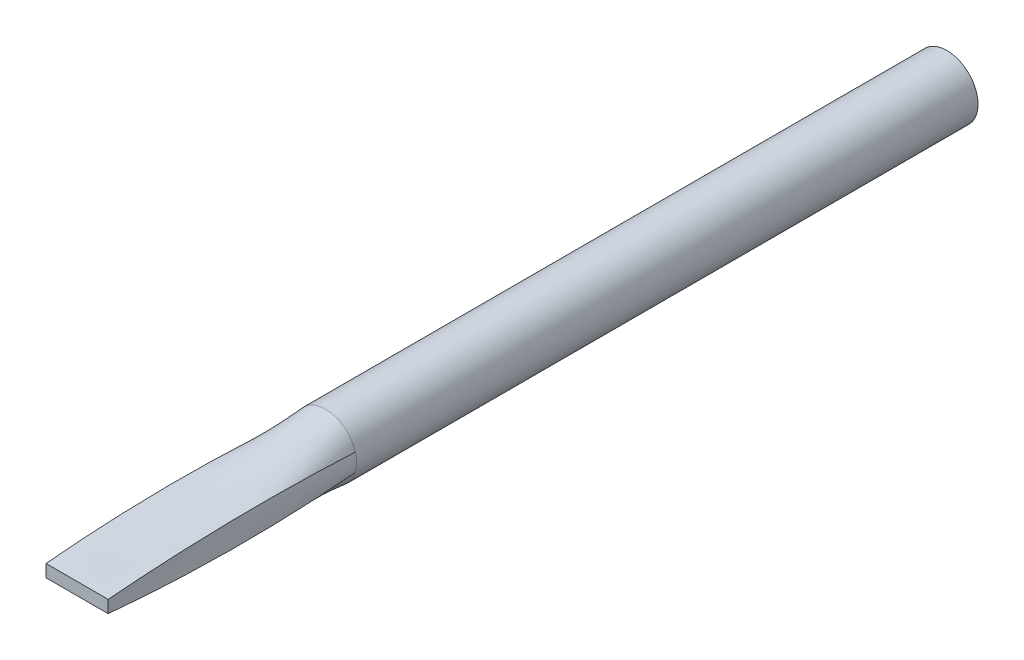
ISO-10303-21;
HEADER;
FILE_DESCRIPTION(('STEP AP214'),'2;1');
FILE_NAME('part.step','',(''),(''),'','','');
FILE_SCHEMA(('AUTOMOTIVE_DESIGN { 1 0 10303 214 1 1 1 1 }'));
ENDSEC;
DATA;
#1=APPLICATION_CONTEXT('core data for automotive mechanical design processes');
#2=APPLICATION_PROTOCOL_DEFINITION('international standard','automotive_design',2000,#1);
#3=PRODUCT_CONTEXT('',#1,'mechanical');
#4=PRODUCT('Part','Part','',(#3));
#5=PRODUCT_RELATED_PRODUCT_CATEGORY('part','',(#4));
#6=PRODUCT_DEFINITION_FORMATION('','',#4);
#7=PRODUCT_DEFINITION_CONTEXT('part definition',#1,'design');
#8=PRODUCT_DEFINITION('design','',#6,#7);
#9=PRODUCT_DEFINITION_SHAPE('','',#8);
#10=(LENGTH_UNIT() NAMED_UNIT(*) SI_UNIT(.MILLI.,.METRE.));
#11=(NAMED_UNIT(*) PLANE_ANGLE_UNIT() SI_UNIT($,.RADIAN.));
#12=(NAMED_UNIT(*) SI_UNIT($,.STERADIAN.) SOLID_ANGLE_UNIT());
#13=UNCERTAINTY_MEASURE_WITH_UNIT(LENGTH_MEASURE(1.E-05),#10,'distance_accuracy_value','');
#14=(GEOMETRIC_REPRESENTATION_CONTEXT(3) GLOBAL_UNCERTAINTY_ASSIGNED_CONTEXT((#13)) GLOBAL_UNIT_ASSIGNED_CONTEXT((#10,
#11,#12)) REPRESENTATION_CONTEXT('',''));
#15=CARTESIAN_POINT('',(0.,0.,0.));
#16=DIRECTION('',(0.,0.,1.));
#17=DIRECTION('',(1.,0.,0.));
#18=AXIS2_PLACEMENT_3D('',#15,#16,#17);
#19=CARTESIAN_POINT('',(0.,0.,127.));
#20=DIRECTION('',(0.,0.,-1.));
#21=DIRECTION('',(-1.,0.,0.));
#22=AXIS2_PLACEMENT_3D('',#19,#20,#21);
#23=CYLINDRICAL_SURFACE('',#22,6.35);
#24=CARTESIAN_POINT('',(6.08675008896476,1.80941243349533,127.));
#25=CARTESIAN_POINT('',(5.88662893530732,2.4826074592834,127.));
#26=CARTESIAN_POINT('',(5.27712066277255,3.7224132887284,127.));
#27=CARTESIAN_POINT('',(4.0952221483163,4.93319956506952,127.));
#28=CARTESIAN_POINT('',(2.9614420521793,5.64580659727017,127.));
#29=CARTESIAN_POINT('',(1.72926984224055,6.17710534020826,127.));
#30=CARTESIAN_POINT('',(-0.000199118194714638,6.46583814686533,127.));
#31=CARTESIAN_POINT('',(-1.7288815989428,6.17717120786637,127.));
#32=CARTESIAN_POINT('',(-2.9615046096893,5.64580968166895,127.));
#33=CARTESIAN_POINT('',(-4.09507070022622,4.93328659384653,127.));
#34=CARTESIAN_POINT('',(-5.27721129069912,3.72236060594632,127.));
#35=CARTESIAN_POINT('',(-5.88662893530732,2.4826074592834,127.));
#36=CARTESIAN_POINT('',(-6.08675008896476,1.80941243349533,127.));
#37=B_SPLINE_CURVE_WITH_KNOTS('',3,(#24,#25,#26,#27,#28,#29,#30,#31,#32,#33,#34,#35,#36),
.UNSPECIFIED.,.F.,.F.,(4,1,1,1,1,1,1,1,1,1,4),(0.,0.125,0.25,0.3125,0.375,0.5,0.625,0.6875,0.75,
0.875,1.),.UNSPECIFIED.);
#38=CARTESIAN_POINT('',(6.08678603843591,1.8094231221408,127.));
#39=VERTEX_POINT('',#38);
#40=CARTESIAN_POINT('',(-6.08678456255015,1.80942267357701,127.));
#41=VERTEX_POINT('',#40);
#42=EDGE_CURVE('E12',#39,#41,#37,.T.);
#43=ORIENTED_EDGE('',*,*,#42,.F.);
#44=CARTESIAN_POINT('',(0.,0.,127.));
#45=DIRECTION('',(0.,0.,-1.));
#46=DIRECTION('',(1.,0.,0.));
#47=AXIS2_PLACEMENT_3D('',#44,#45,#46);
#48=CIRCLE('',#47,6.35);
#49=CARTESIAN_POINT('',(6.08678456254978,-1.8094226735769,127.));
#50=VERTEX_POINT('',#49);
#51=EDGE_CURVE('E131',#50,#39,#48,.F.);
#52=ORIENTED_EDGE('',*,*,#51,.F.);
#53=CARTESIAN_POINT('',(0.,0.,127.));
#54=DIRECTION('',(0.,0.,1.));
#55=DIRECTION('',(1.,0.,0.));
#56=AXIS2_PLACEMENT_3D('',#53,#54,#55);
#57=CIRCLE('',#56,6.35);
#58=CARTESIAN_POINT('',(-6.08678603843585,-1.80942312214078,127.));
#59=VERTEX_POINT('',#58);
#60=EDGE_CURVE('E117',#59,#50,#57,.T.);
#61=ORIENTED_EDGE('',*,*,#60,.F.);
#62=CARTESIAN_POINT('',(0.,0.,127.));
#63=DIRECTION('',(0.,0.,1.));
#64=DIRECTION('',(1.,0.,0.));
#65=AXIS2_PLACEMENT_3D('',#62,#63,#64);
#66=CIRCLE('',#65,6.35);
#67=EDGE_CURVE('E136',#41,#59,#66,.T.);
#68=ORIENTED_EDGE('',*,*,#67,.F.);
#69=EDGE_LOOP('',(#43,#52,#61,#68));
#70=FACE_BOUND('',#69,.T.);
#71=CARTESIAN_POINT('',(0.,0.,0.));
#72=DIRECTION('',(0.,0.,1.));
#73=DIRECTION('',(1.,0.,0.));
#74=AXIS2_PLACEMENT_3D('',#71,#72,#73);
#75=CIRCLE('',#74,6.35);
#76=CARTESIAN_POINT('',(6.35,0.,0.));
#77=VERTEX_POINT('',#76);
#78=EDGE_CURVE('E124',#77,#77,#75,.T.);
#79=ORIENTED_EDGE('',*,*,#78,.T.);
#80=EDGE_LOOP('',(#79));
#81=FACE_BOUND('',#80,.T.);
#82=ADVANCED_FACE('F113',(#70,#81),#23,.T.);
#83=CARTESIAN_POINT('',(0.,0.,0.));
#84=DIRECTION('',(0.,0.,1.));
#85=DIRECTION('',(1.,0.,0.));
#86=AXIS2_PLACEMENT_3D('',#83,#84,#85);
#87=PLANE('',#86);
#88=ORIENTED_EDGE('',*,*,#78,.F.);
#89=EDGE_LOOP('',(#88));
#90=FACE_BOUND('',#89,.T.);
#91=ADVANCED_FACE('F355',(#90),#87,.F.);
#92=CARTESIAN_POINT('',(0.,0.,177.8));
#93=DIRECTION('',(0.,0.,1.));
#94=DIRECTION('',(1.,0.,0.));
#95=AXIS2_PLACEMENT_3D('',#92,#93,#94);
#96=PLANE('',#95);
#97=DIRECTION('',(0.,1.,0.));
#98=VECTOR('',#97,1.);
#99=CARTESIAN_POINT('',(6.35,1.27,177.8));
#100=LINE('',#99,#98);
#101=CARTESIAN_POINT('',(6.35,-1.27,177.8));
#102=VERTEX_POINT('',#101);
#103=CARTESIAN_POINT('',(6.35,1.27,177.8));
#104=VERTEX_POINT('',#103);
#105=EDGE_CURVE('E183',#102,#104,#100,.T.);
#106=ORIENTED_EDGE('',*,*,#105,.T.);
#107=DIRECTION('',(-1.,0.,0.));
#108=VECTOR('',#107,1.);
#109=CARTESIAN_POINT('',(-6.35,1.27,177.8));
#110=LINE('',#109,#108);
#111=CARTESIAN_POINT('',(-6.35,1.27,177.8));
#112=VERTEX_POINT('',#111);
#113=EDGE_CURVE('E163',#104,#112,#110,.T.);
#114=ORIENTED_EDGE('',*,*,#113,.T.);
#115=DIRECTION('',(0.,-1.,0.));
#116=VECTOR('',#115,1.);
#117=CARTESIAN_POINT('',(-6.35,1.27,177.8));
#118=LINE('',#117,#116);
#119=CARTESIAN_POINT('',(-6.35,-1.27,177.8));
#120=VERTEX_POINT('',#119);
#121=EDGE_CURVE('E154',#112,#120,#118,.T.);
#122=ORIENTED_EDGE('',*,*,#121,.T.);
#123=DIRECTION('',(1.,0.,0.));
#124=VECTOR('',#123,1.);
#125=CARTESIAN_POINT('',(-6.35,-1.27,177.8));
#126=LINE('',#125,#124);
#127=EDGE_CURVE('E159',#120,#102,#126,.T.);
#128=ORIENTED_EDGE('',*,*,#127,.T.);
#129=EDGE_LOOP('',(#106,#114,#122,#128));
#130=FACE_BOUND('',#129,.T.);
#131=ADVANCED_FACE('F158',(#130),#96,.T.);
#132=CARTESIAN_POINT('',(6.08675008896476,1.80941243349533,127.));
#133=CARTESIAN_POINT('',(6.21839221099425,2.38633770835992,135.469979331806));
#134=CARTESIAN_POINT('',(6.39367456706093,2.87384285204551,152.361306329476));
#135=CARTESIAN_POINT('',(6.39389215168441,2.02672941936304,169.336645998472));
#136=CARTESIAN_POINT('',(6.35,1.27,177.8));
#137=CARTESIAN_POINT('',(5.88662893530732,2.4826074592834,127.));
#138=CARTESIAN_POINT('',(5.88382088402349,2.73817024314201,135.470398235068));
#139=CARTESIAN_POINT('',(5.7898783330942,2.75199844276133,152.360887425299));
#140=CARTESIAN_POINT('',(5.8198892283466,1.91954425402526,169.337064901735));
#141=CARTESIAN_POINT('',(5.82083333333333,1.27,177.8));
#142=CARTESIAN_POINT('',(5.27712066277255,3.7224132887284,127.));
#143=CARTESIAN_POINT('',(5.00541226486208,3.33525109057502,135.471236041592));
#144=CARTESIAN_POINT('',(4.68670045297844,2.56149050150381,152.360049616946));
#145=CARTESIAN_POINT('',(4.67188338167096,1.70517392334972,169.337902708259));
#146=CARTESIAN_POINT('',(4.7625,1.27,177.8));
#147=CARTESIAN_POINT('',(4.0952221483163,4.93319956506952,127.));
#148=CARTESIAN_POINT('',(3.76935955722444,3.95008554288471,135.452465824941));
#149=CARTESIAN_POINT('',(3.32940195376154,2.35383380275496,152.37881987457));
#150=CARTESIAN_POINT('',(3.33108512887952,1.50734995036563,169.319132491608));
#151=CARTESIAN_POINT('',(3.43958333333333,1.27,177.8));
#152=CARTESIAN_POINT('',(2.9614420521793,5.64580659727017,127.));
#153=CARTESIAN_POINT('',(2.67133453203728,4.30670201401367,135.439690378247));
#154=CARTESIAN_POINT('',(2.2848579299932,2.2348912499158,152.391595349152));
#155=CARTESIAN_POINT('',(2.28475691189425,1.38960919923241,169.306357044913));
#156=CARTESIAN_POINT('',(2.38125,1.27,177.8));
#157=CARTESIAN_POINT('',(1.72926984224055,6.17710534020826,127.));
#158=CARTESIAN_POINT('',(1.52659802327358,4.5739484135369,135.428697008474));
#159=CARTESIAN_POINT('',(1.25502966256591,2.14520372563824,152.402588742921));
#160=CARTESIAN_POINT('',(1.25557530338823,1.30247790214429,169.295363675141));
#161=CARTESIAN_POINT('',(1.32291666666667,1.27,177.8));
#162=CARTESIAN_POINT('',(-0.000199118194714638,6.46583814686533,127.));
#163=CARTESIAN_POINT('',(-9.97323945062288E-05,4.71908730216013,135.422108275891));
#164=CARTESIAN_POINT('',(3.32115469491224E-05,2.09645418026079,152.409177489886));
#165=CARTESIAN_POINT('',(3.30320443327299E-05,1.25523984853949,169.288774942557));
#166=CARTESIAN_POINT('',(0.,1.27,177.8));
#167=CARTESIAN_POINT('',(-1.7288815989428,6.17717120786637,127.));
#168=CARTESIAN_POINT('',(-1.52640355430358,4.5739814854675,135.428696499264));
#169=CARTESIAN_POINT('',(-1.25509441831998,2.14519267065703,152.402589252132));
#170=CARTESIAN_POINT('',(-1.25563972021048,1.3024670319416,169.295363165931));
#171=CARTESIAN_POINT('',(-1.32291666666667,1.27,177.8));
#172=CARTESIAN_POINT('',(-2.9615046096893,5.64580968166895,127.));
#173=CARTESIAN_POINT('',(-2.67136599593577,4.30670349941177,135.439690133395));
#174=CARTESIAN_POINT('',(-2.28484740968318,2.23489076741558,152.391595594004));
#175=CARTESIAN_POINT('',(-2.2847465759076,1.38960868301486,169.306356800062));
#176=CARTESIAN_POINT('',(-2.38125,1.27,177.8));
#177=CARTESIAN_POINT('',(-4.09507070022622,4.93328659384653,127.));
#178=CARTESIAN_POINT('',(-3.76928301461781,3.95012959195073,135.452464982665));
#179=CARTESIAN_POINT('',(-3.32942765154064,2.35381897294306,152.378820716848));
#180=CARTESIAN_POINT('',(-3.33111006401009,1.50733568270706,169.319131649332));
#181=CARTESIAN_POINT('',(-3.43958333333333,1.27,177.8));
#182=CARTESIAN_POINT('',(-5.27721129069912,3.72236060594632,127.));
#183=CARTESIAN_POINT('',(-5.00546379892161,3.33522111241195,135.471236353842));
#184=CARTESIAN_POINT('',(-4.68668126397854,2.5615016772554,152.360049304696));
#185=CARTESIAN_POINT('',(-4.67187036041093,1.70518147164968,169.337903020509));
#186=CARTESIAN_POINT('',(-4.7625,1.27,177.8));
#187=CARTESIAN_POINT('',(-5.88662893530732,2.4826074592834,127.));
#188=CARTESIAN_POINT('',(-5.88380785273448,2.73817781134834,135.470398339151));
#189=CARTESIAN_POINT('',(-5.7898870098882,2.75199340587517,152.360887321216));
#190=CARTESIAN_POINT('',(-5.81988488792659,1.91954677012525,169.337065005818));
#191=CARTESIAN_POINT('',(-5.82083333333333,1.27,177.8));
#192=CARTESIAN_POINT('',(-6.08675008896476,1.80941243349533,127.));
#193=CARTESIAN_POINT('',(-6.21839221099425,2.38633770835992,135.469979331806));
#194=CARTESIAN_POINT('',(-6.39367456706094,2.87384285204551,152.361306329476));
#195=CARTESIAN_POINT('',(-6.39389215168441,2.02672941936304,169.336645998472));
#196=CARTESIAN_POINT('',(-6.35,1.27,177.8));
#197=B_SPLINE_SURFACE_WITH_KNOTS('',3,3,((#132,#133,#134,#135,#136),(#137,#138,#139,#140,#141),
(#142,#143,#144,#145,#146),(#147,#148,#149,#150,#151),(#152,#153,#154,#155,#156),(#157,#158,
#159,#160,#161),(#162,#163,#164,#165,#166),(#167,#168,#169,#170,#171),(#172,#173,#174,#175,
#176),(#177,#178,#179,#180,#181),(#182,#183,#184,#185,#186),(#187,#188,#189,#190,#191),(#192,
#193,#194,#195,#196)),.UNSPECIFIED.,.F.,.F.,.F.,(4,1,1,1,1,1,1,1,1,1,4),(4,1,4),(0.,0.125,0.25,
0.3125,0.375,0.5,0.625,0.6875,0.75,0.875,1.),(0.,0.500522356686095,1.),.UNSPECIFIED.);
#198=CARTESIAN_POINT('',(-6.08675008896476,1.80941243349533,127.));
#199=CARTESIAN_POINT('',(-6.21839221099425,2.38633770835992,135.469979331806));
#200=CARTESIAN_POINT('',(-6.39367456706094,2.87384285204551,152.361306329476));
#201=CARTESIAN_POINT('',(-6.39389215168441,2.02672941936304,169.336645998472));
#202=CARTESIAN_POINT('',(-6.35,1.27,177.8));
#203=B_SPLINE_CURVE_WITH_KNOTS('',3,(#198,#199,#200,#201,#202),.UNSPECIFIED.,.F.,.F.,(4,1,4),
(0.,0.500522356686095,1.),.UNSPECIFIED.);
#204=EDGE_CURVE('E189',#41,#112,#203,.T.);
#205=CARTESIAN_POINT('',(6.08675008896476,1.80941243349533,127.));
#206=CARTESIAN_POINT('',(6.21839221099425,2.38633770835992,135.469979331806));
#207=CARTESIAN_POINT('',(6.39367456706093,2.87384285204551,152.361306329476));
#208=CARTESIAN_POINT('',(6.39389215168441,2.02672941936304,169.336645998472));
#209=CARTESIAN_POINT('',(6.35,1.27,177.8));
#210=B_SPLINE_CURVE_WITH_KNOTS('',3,(#205,#206,#207,#208,#209),.UNSPECIFIED.,.F.,.F.,(4,1,4),
(0.,0.500522356686095,1.),.UNSPECIFIED.);
#211=EDGE_CURVE('E194',#104,#39,#210,.F.);
#212=ORIENTED_EDGE('',*,*,#42,.T.);
#213=ORIENTED_EDGE('',*,*,#204,.T.);
#214=ORIENTED_EDGE('',*,*,#113,.F.);
#215=ORIENTED_EDGE('',*,*,#211,.T.);
#216=EDGE_LOOP('',(#212,#213,#214,#215));
#217=FACE_BOUND('',#216,.T.);
#218=ADVANCED_FACE('F226',(#217),#197,.T.);
#219=CARTESIAN_POINT('',(-6.08675008896476,1.80941243349533,127.));
#220=CARTESIAN_POINT('',(-6.21839221099425,2.38633770835992,135.469979331806));
#221=CARTESIAN_POINT('',(-6.39367456706094,2.87384285204551,152.361306329476));
#222=CARTESIAN_POINT('',(-6.39389215168441,2.02672941936304,169.336645998472));
#223=CARTESIAN_POINT('',(-6.35,1.27,177.8));
#224=CARTESIAN_POINT('',(-6.43773733835281,0.628713311564739,127.));
#225=CARTESIAN_POINT('',(-6.56937946038231,0.821021736519602,135.469979331806));
#226=CARTESIAN_POINT('',(-6.21854724076298,0.945186392012529,152.361306329476));
#227=CARTESIAN_POINT('',(-6.39389215168441,0.675576473121011,169.336645998472));
#228=CARTESIAN_POINT('',(-6.35,0.423333333333333,177.8));
#229=CARTESIAN_POINT('',(-6.43773733835281,-0.628713311564736,127.));
#230=CARTESIAN_POINT('',(-6.56937946038231,-0.821021736519603,135.469979331806));
#231=CARTESIAN_POINT('',(-6.21854724076298,-0.945186392012532,152.361306329476));
#232=CARTESIAN_POINT('',(-6.39389215168441,-0.675576473121014,169.336645998472));
#233=CARTESIAN_POINT('',(-6.35,-0.423333333333333,177.8));
#234=CARTESIAN_POINT('',(-6.08675008896476,-1.80941243349533,127.));
#235=CARTESIAN_POINT('',(-6.21839221099425,-2.38633770835992,135.469979331806));
#236=CARTESIAN_POINT('',(-6.39367456706093,-2.87384285204551,152.361306329476));
#237=CARTESIAN_POINT('',(-6.39389215168441,-2.02672941936304,169.336645998472));
#238=CARTESIAN_POINT('',(-6.35,-1.27,177.8));
#239=B_SPLINE_SURFACE_WITH_KNOTS('',3,3,((#219,#220,#221,#222,#223),(#224,#225,#226,#227,#228),
(#229,#230,#231,#232,#233),(#234,#235,#236,#237,#238)),.UNSPECIFIED.,.F.,.F.,.F.,(4,4),(4,1,4),
(0.,1.),(0.,0.500522356686095,1.),.UNSPECIFIED.);
#240=CARTESIAN_POINT('',(-6.08675008896476,-1.80941243349533,127.));
#241=CARTESIAN_POINT('',(-6.21839221099425,-2.38633770835992,135.469979331806));
#242=CARTESIAN_POINT('',(-6.39367456706093,-2.87384285204551,152.361306329476));
#243=CARTESIAN_POINT('',(-6.39389215168441,-2.02672941936304,169.336645998472));
#244=CARTESIAN_POINT('',(-6.35,-1.27,177.8));
#245=B_SPLINE_CURVE_WITH_KNOTS('',3,(#240,#241,#242,#243,#244),.UNSPECIFIED.,.F.,.F.,(4,1,4),
(0.,0.500522356686095,1.),.UNSPECIFIED.);
#246=EDGE_CURVE('E179',#59,#120,#245,.T.);
#247=ORIENTED_EDGE('',*,*,#67,.T.);
#248=ORIENTED_EDGE('',*,*,#246,.T.);
#249=ORIENTED_EDGE('',*,*,#121,.F.);
#250=ORIENTED_EDGE('',*,*,#204,.F.);
#251=EDGE_LOOP('',(#247,#248,#249,#250));
#252=FACE_BOUND('',#251,.T.);
#253=ADVANCED_FACE('F187',(#252),#239,.T.);
#254=CARTESIAN_POINT('',(6.08675008896476,-1.80941243349533,127.));
#255=CARTESIAN_POINT('',(6.21839221099425,-2.38633770835992,135.469979331806));
#256=CARTESIAN_POINT('',(6.39367456706094,-2.87384285204551,152.361306329476));
#257=CARTESIAN_POINT('',(6.39389215168441,-2.02672941936304,169.336645998472));
#258=CARTESIAN_POINT('',(6.35,-1.27,177.8));
#259=CARTESIAN_POINT('',(6.43773733835281,-0.628713311564739,127.));
#260=CARTESIAN_POINT('',(6.56937946038231,-0.821021736519604,135.469979331806));
#261=CARTESIAN_POINT('',(6.21854724076298,-0.945186392012532,152.361306329476));
#262=CARTESIAN_POINT('',(6.39389215168441,-0.675576473121013,169.336645998472));
#263=CARTESIAN_POINT('',(6.35,-0.423333333333333,177.8));
#264=CARTESIAN_POINT('',(6.43773733835281,0.628713311564736,127.));
#265=CARTESIAN_POINT('',(6.56937946038231,0.821021736519601,135.469979331806));
#266=CARTESIAN_POINT('',(6.21854724076298,0.945186392012529,152.361306329476));
#267=CARTESIAN_POINT('',(6.39389215168441,0.675576473121012,169.336645998472));
#268=CARTESIAN_POINT('',(6.35,0.423333333333333,177.8));
#269=CARTESIAN_POINT('',(6.08675008896476,1.80941243349533,127.));
#270=CARTESIAN_POINT('',(6.21839221099425,2.38633770835992,135.469979331806));
#271=CARTESIAN_POINT('',(6.39367456706093,2.87384285204551,152.361306329476));
#272=CARTESIAN_POINT('',(6.39389215168441,2.02672941936304,169.336645998472));
#273=CARTESIAN_POINT('',(6.35,1.27,177.8));
#274=B_SPLINE_SURFACE_WITH_KNOTS('',3,3,((#254,#255,#256,#257,#258),(#259,#260,#261,#262,#263),
(#264,#265,#266,#267,#268),(#269,#270,#271,#272,#273)),.UNSPECIFIED.,.F.,.F.,.F.,(4,4),(4,1,4),
(0.,1.),(0.,0.500522356686095,1.),.UNSPECIFIED.);
#275=CARTESIAN_POINT('',(6.08675008896476,-1.80941243349533,127.));
#276=CARTESIAN_POINT('',(6.21839221099425,-2.38633770835992,135.469979331806));
#277=CARTESIAN_POINT('',(6.39367456706093,-2.87384285204551,152.361306329476));
#278=CARTESIAN_POINT('',(6.39389215168441,-2.02672941936304,169.336645998472));
#279=CARTESIAN_POINT('',(6.35,-1.27,177.8));
#280=B_SPLINE_CURVE_WITH_KNOTS('',3,(#275,#276,#277,#278,#279),.UNSPECIFIED.,.F.,.F.,(4,1,4),
(0.,0.500522356686095,1.),.UNSPECIFIED.);
#281=EDGE_CURVE('E181',#50,#102,#280,.T.);
#282=ORIENTED_EDGE('',*,*,#51,.T.);
#283=ORIENTED_EDGE('',*,*,#211,.F.);
#284=ORIENTED_EDGE('',*,*,#105,.F.);
#285=ORIENTED_EDGE('',*,*,#281,.F.);
#286=EDGE_LOOP('',(#282,#283,#284,#285));
#287=FACE_BOUND('',#286,.T.);
#288=ADVANCED_FACE('F308',(#287),#274,.T.);
#289=CARTESIAN_POINT('',(-6.08675008896476,-1.80941243349533,127.));
#290=CARTESIAN_POINT('',(-6.21839221099425,-2.38633770835992,135.469979331806));
#291=CARTESIAN_POINT('',(-6.39367456706093,-2.87384285204551,152.361306329476));
#292=CARTESIAN_POINT('',(-6.39389215168441,-2.02672941936304,169.336645998472));
#293=CARTESIAN_POINT('',(-6.35,-1.27,177.8));
#294=CARTESIAN_POINT('',(-5.88662893530732,-2.4826074592834,127.));
#295=CARTESIAN_POINT('',(-5.88382088402349,-2.73817024314201,135.470398235068));
#296=CARTESIAN_POINT('',(-5.78987833309421,-2.75199844276133,152.360887425299));
#297=CARTESIAN_POINT('',(-5.8198892283466,-1.91954425402527,169.337064901735));
#298=CARTESIAN_POINT('',(-5.82083333333333,-1.27,177.8));
#299=CARTESIAN_POINT('',(-5.27712066277255,-3.72241328872839,127.));
#300=CARTESIAN_POINT('',(-5.00541226486208,-3.33525109057502,135.471236041592));
#301=CARTESIAN_POINT('',(-4.68670045297844,-2.56149050150381,152.360049616946));
#302=CARTESIAN_POINT('',(-4.67188338167096,-1.70517392334973,169.337902708259));
#303=CARTESIAN_POINT('',(-4.7625,-1.27,177.8));
#304=CARTESIAN_POINT('',(-4.09522214831631,-4.93319956506953,127.));
#305=CARTESIAN_POINT('',(-3.76935955722444,-3.95008554288472,135.452465824942));
#306=CARTESIAN_POINT('',(-3.32940195376154,-2.35383380275497,152.37881987457));
#307=CARTESIAN_POINT('',(-3.33108512887952,-1.50734995036563,169.319132491608));
#308=CARTESIAN_POINT('',(-3.43958333333333,-1.27,177.8));
#309=CARTESIAN_POINT('',(-2.9614420521793,-5.64580659727016,127.));
#310=CARTESIAN_POINT('',(-2.67133453203728,-4.30670201401367,135.439690378247));
#311=CARTESIAN_POINT('',(-2.2848579299932,-2.2348912499158,152.391595349152));
#312=CARTESIAN_POINT('',(-2.28475691189425,-1.38960919923242,169.306357044913));
#313=CARTESIAN_POINT('',(-2.38125,-1.27,177.8));
#314=CARTESIAN_POINT('',(-1.72926984224055,-6.17710534020827,127.));
#315=CARTESIAN_POINT('',(-1.52659802327358,-4.5739484135369,135.428697008474));
#316=CARTESIAN_POINT('',(-1.25502966256591,-2.14520372563825,152.402588742921));
#317=CARTESIAN_POINT('',(-1.25557530338823,-1.30247790214429,169.295363675141));
#318=CARTESIAN_POINT('',(-1.32291666666667,-1.27,177.8));
#319=CARTESIAN_POINT('',(0.000199118194714422,-6.46583814686532,127.));
#320=CARTESIAN_POINT('',(9.97323945047554E-05,-4.71908730216013,135.422108275891));
#321=CARTESIAN_POINT('',(-3.32115469497896E-05,-2.09645418026079,152.409177489886));
#322=CARTESIAN_POINT('',(-3.30320443355571E-05,-1.2552398485395,169.288774942557));
#323=CARTESIAN_POINT('',(0.,-1.27,177.8));
#324=CARTESIAN_POINT('',(1.72888159894279,-6.17717120786638,127.));
#325=CARTESIAN_POINT('',(1.52640355430358,-4.5739814854675,135.428696499264));
#326=CARTESIAN_POINT('',(1.25509441831998,-2.14519267065704,152.402589252132));
#327=CARTESIAN_POINT('',(1.25563972021049,-1.3024670319416,169.295363165931));
#328=CARTESIAN_POINT('',(1.32291666666667,-1.27,177.8));
#329=CARTESIAN_POINT('',(2.9615046096893,-5.64580968166895,127.));
#330=CARTESIAN_POINT('',(2.67136599593577,-4.30670349941178,135.439690133395));
#331=CARTESIAN_POINT('',(2.28484740968318,-2.23489076741558,152.391595594004));
#332=CARTESIAN_POINT('',(2.28474657590759,-1.38960868301487,169.306356800062));
#333=CARTESIAN_POINT('',(2.38125,-1.27,177.8));
#334=CARTESIAN_POINT('',(4.09507070022621,-4.93328659384654,127.));
#335=CARTESIAN_POINT('',(3.76928301461781,-3.95012959195073,135.452464982665));
#336=CARTESIAN_POINT('',(3.32942765154064,-2.35381897294307,152.378820716848));
#337=CARTESIAN_POINT('',(3.33111006401009,-1.50733568270705,169.319131649332));
#338=CARTESIAN_POINT('',(3.43958333333333,-1.27,177.8));
#339=CARTESIAN_POINT('',(5.27721129069913,-3.72236060594632,127.));
#340=CARTESIAN_POINT('',(5.00546379892161,-3.33522111241196,135.471236353842));
#341=CARTESIAN_POINT('',(4.68668126397854,-2.5615016772554,152.360049304696));
#342=CARTESIAN_POINT('',(4.67187036041093,-1.70518147164969,169.337903020509));
#343=CARTESIAN_POINT('',(4.7625,-1.27,177.8));
#344=CARTESIAN_POINT('',(5.88662893530732,-2.4826074592834,127.));
#345=CARTESIAN_POINT('',(5.88380785273448,-2.73817781134835,135.470398339151));
#346=CARTESIAN_POINT('',(5.7898870098882,-2.75199340587517,152.360887321216));
#347=CARTESIAN_POINT('',(5.81988488792659,-1.91954677012525,169.337065005818));
#348=CARTESIAN_POINT('',(5.82083333333333,-1.27,177.8));
#349=CARTESIAN_POINT('',(6.08675008896476,-1.80941243349533,127.));
#350=CARTESIAN_POINT('',(6.21839221099425,-2.38633770835992,135.469979331806));
#351=CARTESIAN_POINT('',(6.39367456706093,-2.87384285204551,152.361306329476));
#352=CARTESIAN_POINT('',(6.39389215168441,-2.02672941936304,169.336645998472));
#353=CARTESIAN_POINT('',(6.35,-1.27,177.8));
#354=B_SPLINE_SURFACE_WITH_KNOTS('',3,3,((#289,#290,#291,#292,#293),(#294,#295,#296,#297,#298),
(#299,#300,#301,#302,#303),(#304,#305,#306,#307,#308),(#309,#310,#311,#312,#313),(#314,#315,
#316,#317,#318),(#319,#320,#321,#322,#323),(#324,#325,#326,#327,#328),(#329,#330,#331,#332,
#333),(#334,#335,#336,#337,#338),(#339,#340,#341,#342,#343),(#344,#345,#346,#347,#348),(#349,
#350,#351,#352,#353)),.UNSPECIFIED.,.F.,.F.,.F.,(4,1,1,1,1,1,1,1,1,1,4),(4,1,4),(0.,0.125,0.25,
0.3125,0.375,0.5,0.625,0.6875,0.75,0.875,1.),(0.,0.500522356686095,1.),.UNSPECIFIED.);
#355=ORIENTED_EDGE('',*,*,#60,.T.);
#356=ORIENTED_EDGE('',*,*,#281,.T.);
#357=ORIENTED_EDGE('',*,*,#127,.F.);
#358=ORIENTED_EDGE('',*,*,#246,.F.);
#359=EDGE_LOOP('',(#355,#356,#357,#358));
#360=FACE_BOUND('',#359,.T.);
#361=ADVANCED_FACE('F178',(#360),#354,.T.);
#362=CLOSED_SHELL('',(#82,#91,#131,#218,#253,#288,#361));
#363=MANIFOLD_SOLID_BREP('B2',#362);
#364=ADVANCED_BREP_SHAPE_REPRESENTATION('',(#18,#363),#14);
#365=SHAPE_DEFINITION_REPRESENTATION(#9,#364);
ENDSEC;
END-ISO-10303-21;
